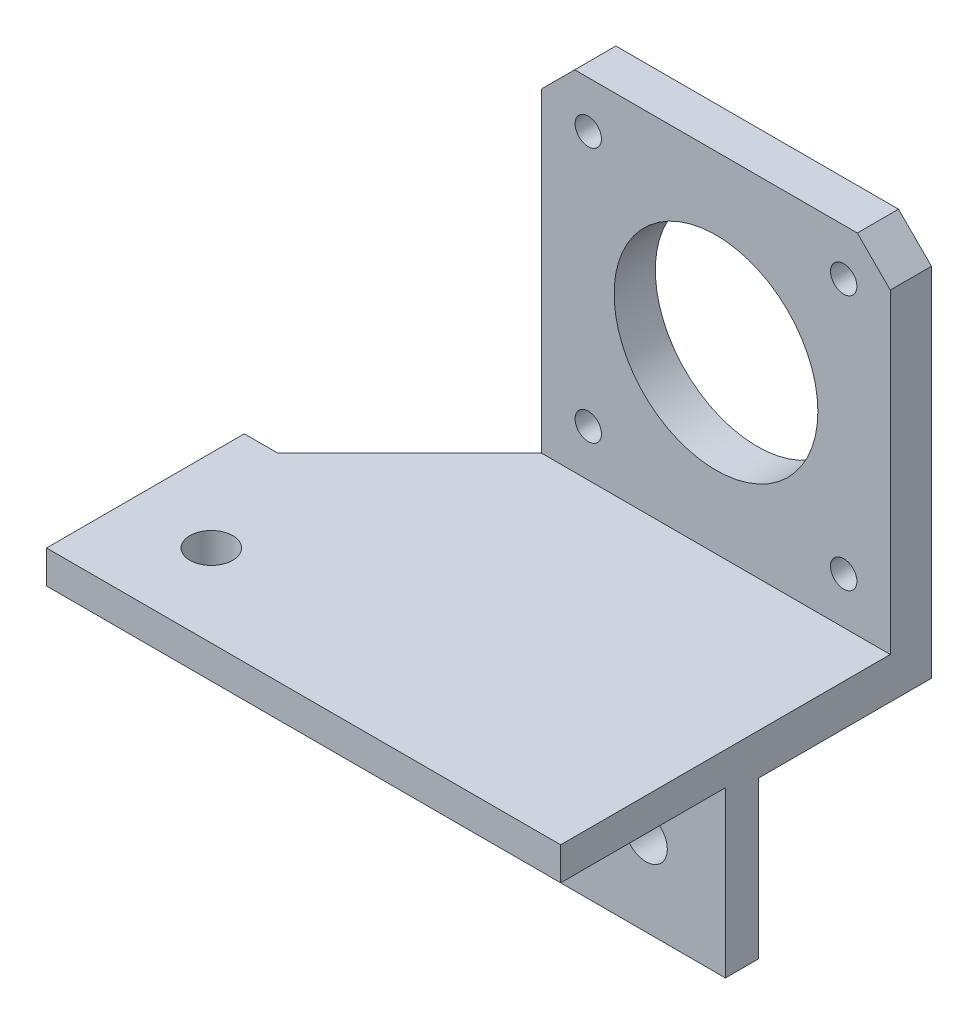
ISO-10303-21;
HEADER;
FILE_DESCRIPTION(('STEP AP214'),'2;1');
FILE_NAME('part.step','',(''),(''),'','','');
FILE_SCHEMA(('AUTOMOTIVE_DESIGN { 1 0 10303 214 1 1 1 1 }'));
ENDSEC;
DATA;
#1=APPLICATION_CONTEXT('core data for automotive mechanical design processes');
#2=APPLICATION_PROTOCOL_DEFINITION('international standard','automotive_design',2000,#1);
#3=PRODUCT_CONTEXT('',#1,'mechanical');
#4=PRODUCT('Part','Part','',(#3));
#5=PRODUCT_RELATED_PRODUCT_CATEGORY('part','',(#4));
#6=PRODUCT_DEFINITION_FORMATION('','',#4);
#7=PRODUCT_DEFINITION_CONTEXT('part definition',#1,'design');
#8=PRODUCT_DEFINITION('design','',#6,#7);
#9=PRODUCT_DEFINITION_SHAPE('','',#8);
#10=(LENGTH_UNIT() NAMED_UNIT(*) SI_UNIT(.MILLI.,.METRE.));
#11=(NAMED_UNIT(*) PLANE_ANGLE_UNIT() SI_UNIT($,.RADIAN.));
#12=(NAMED_UNIT(*) SI_UNIT($,.STERADIAN.) SOLID_ANGLE_UNIT());
#13=UNCERTAINTY_MEASURE_WITH_UNIT(LENGTH_MEASURE(1.E-05),#10,'distance_accuracy_value','');
#14=(GEOMETRIC_REPRESENTATION_CONTEXT(3) GLOBAL_UNCERTAINTY_ASSIGNED_CONTEXT((#13)) GLOBAL_UNIT_ASSIGNED_CONTEXT((#10,
#11,#12)) REPRESENTATION_CONTEXT('',''));
#15=CARTESIAN_POINT('',(0.,0.,0.));
#16=DIRECTION('',(0.,0.,1.));
#17=DIRECTION('',(1.,0.,0.));
#18=AXIS2_PLACEMENT_3D('',#15,#16,#17);
#19=CARTESIAN_POINT('',(0.,0.,-40.));
#20=DIRECTION('',(0.,0.,-1.));
#21=DIRECTION('',(1.,0.,0.));
#22=AXIS2_PLACEMENT_3D('',#19,#20,#21);
#23=PLANE('',#22);
#24=CARTESIAN_POINT('',(-49.6556066891385,-2.97105977085422,-40.));
#25=DIRECTION('',(0.,0.,1.));
#26=DIRECTION('',(1.,0.,0.));
#27=AXIS2_PLACEMENT_3D('',#24,#25,#26);
#28=CIRCLE('',#27,2.6);
#29=CARTESIAN_POINT('',(-47.0556066891385,-2.97105977085422,-40.));
#30=VERTEX_POINT('',#29);
#31=EDGE_CURVE('E181',#30,#30,#28,.T.);
#32=ORIENTED_EDGE('',*,*,#31,.F.);
#33=EDGE_LOOP('',(#32));
#34=FACE_BOUND('',#33,.T.);
#35=CARTESIAN_POINT('',(-69.6556066891385,-2.97105977085422,-40.));
#36=DIRECTION('',(0.,0.,1.));
#37=DIRECTION('',(1.,0.,0.));
#38=AXIS2_PLACEMENT_3D('',#35,#36,#37);
#39=CIRCLE('',#38,2.6);
#40=CARTESIAN_POINT('',(-67.0556066891385,-2.97105977085422,-40.));
#41=VERTEX_POINT('',#40);
#42=EDGE_CURVE('E175',#41,#41,#39,.T.);
#43=ORIENTED_EDGE('',*,*,#42,.F.);
#44=EDGE_LOOP('',(#43));
#45=FACE_BOUND('',#44,.T.);
#46=CARTESIAN_POINT('',(-89.6556066891385,-2.97105977085422,-40.));
#47=DIRECTION('',(0.,0.,1.));
#48=DIRECTION('',(1.,0.,0.));
#49=AXIS2_PLACEMENT_3D('',#46,#47,#48);
#50=CIRCLE('',#49,2.6);
#51=CARTESIAN_POINT('',(-87.0556066891385,-2.97105977085422,-40.));
#52=VERTEX_POINT('',#51);
#53=EDGE_CURVE('E168',#52,#52,#50,.T.);
#54=ORIENTED_EDGE('',*,*,#53,.F.);
#55=EDGE_LOOP('',(#54));
#56=FACE_BOUND('',#55,.T.);
#57=DIRECTION('',(-1.,0.,0.));
#58=VECTOR('',#57,1.);
#59=CARTESIAN_POINT('',(-40.,7.02894022914576,-40.));
#60=LINE('',#59,#58);
#61=CARTESIAN_POINT('',(-40.,7.02894022914575,-40.));
#62=VERTEX_POINT('',#61);
#63=CARTESIAN_POINT('',(-102.391596743468,7.02894022914576,-40.));
#64=VERTEX_POINT('',#63);
#65=EDGE_CURVE('E136',#62,#64,#60,.T.);
#66=ORIENTED_EDGE('',*,*,#65,.T.);
#67=DIRECTION('',(0.,-1.,0.));
#68=VECTOR('',#67,1.);
#69=CARTESIAN_POINT('',(-102.391596743468,-12.9710597708542,-40.));
#70=LINE('',#69,#68);
#71=CARTESIAN_POINT('',(-102.391596743468,-12.9710597708542,-40.));
#72=VERTEX_POINT('',#71);
#73=EDGE_CURVE('E142',#64,#72,#70,.T.);
#74=ORIENTED_EDGE('',*,*,#73,.T.);
#75=DIRECTION('',(1.,0.,0.));
#76=VECTOR('',#75,1.);
#77=CARTESIAN_POINT('',(-40.,-12.9710597708542,-40.));
#78=LINE('',#77,#76);
#79=CARTESIAN_POINT('',(-40.,-12.9710597708542,-40.));
#80=VERTEX_POINT('',#79);
#81=EDGE_CURVE('E151',#72,#80,#78,.T.);
#82=ORIENTED_EDGE('',*,*,#81,.T.);
#83=DIRECTION('',(0.,1.,0.));
#84=VECTOR('',#83,1.);
#85=CARTESIAN_POINT('',(-40.,-12.9710597708542,-40.));
#86=LINE('',#85,#84);
#87=EDGE_CURVE('E152',#80,#62,#86,.T.);
#88=ORIENTED_EDGE('',*,*,#87,.T.);
#89=EDGE_LOOP('',(#66,#74,#82,#88));
#90=FACE_BOUND('',#89,.T.);
#91=ADVANCED_FACE('F33',(#34,#45,#56,#90),#23,.F.);
#92=CARTESIAN_POINT('',(-40.,-12.9710597708542,-44.));
#93=DIRECTION('',(-1.,0.,0.));
#94=DIRECTION('',(0.,0.,-1.));
#95=AXIS2_PLACEMENT_3D('',#92,#93,#94);
#96=PLANE('',#95);
#97=ORIENTED_EDGE('',*,*,#87,.F.);
#98=DIRECTION('',(0.,0.,1.));
#99=VECTOR('',#98,1.);
#100=CARTESIAN_POINT('',(-40.,-12.9710597708542,-44.));
#101=LINE('',#100,#99);
#102=CARTESIAN_POINT('',(-40.,-12.9710597708542,-44.));
#103=VERTEX_POINT('',#102);
#104=EDGE_CURVE('E277',#103,#80,#101,.T.);
#105=ORIENTED_EDGE('',*,*,#104,.F.);
#106=DIRECTION('',(0.,1.,0.));
#107=VECTOR('',#106,1.);
#108=CARTESIAN_POINT('',(-40.,-12.9710597708542,-44.));
#109=LINE('',#108,#107);
#110=CARTESIAN_POINT('',(-40.,6.02894022914576,-44.));
#111=VERTEX_POINT('',#110);
#112=EDGE_CURVE('E267',#103,#111,#109,.T.);
#113=ORIENTED_EDGE('',*,*,#112,.T.);
#114=DIRECTION('',(0.,0.,1.));
#115=VECTOR('',#114,1.);
#116=CARTESIAN_POINT('',(-40.,6.02894022914575,-102.594483210857));
#117=LINE('',#116,#115);
#118=CARTESIAN_POINT('',(-40.,6.02894022914576,-65.));
#119=VERTEX_POINT('',#118);
#120=EDGE_CURVE('E256',#119,#111,#117,.T.);
#121=ORIENTED_EDGE('',*,*,#120,.F.);
#122=DIRECTION('',(0.,1.,0.));
#123=VECTOR('',#122,1.);
#124=CARTESIAN_POINT('',(-40.,6.02894022914576,-65.));
#125=LINE('',#124,#123);
#126=CARTESIAN_POINT('',(-40.0000000000001,49.3289402291458,-65.));
#127=VERTEX_POINT('',#126);
#128=EDGE_CURVE('E217',#119,#127,#125,.T.);
#129=ORIENTED_EDGE('',*,*,#128,.T.);
#130=DIRECTION('',(0.,0.,1.));
#131=VECTOR('',#130,1.);
#132=CARTESIAN_POINT('',(-40.0000000000001,49.3289402291458,-65.));
#133=LINE('',#132,#131);
#134=CARTESIAN_POINT('',(-40.0000000000001,49.3289402291458,-60.));
#135=VERTEX_POINT('',#134);
#136=EDGE_CURVE('E253',#127,#135,#133,.T.);
#137=ORIENTED_EDGE('',*,*,#136,.T.);
#138=DIRECTION('',(0.,1.,0.));
#139=VECTOR('',#138,1.);
#140=CARTESIAN_POINT('',(-40.,6.02894022914576,-60.));
#141=LINE('',#140,#139);
#142=CARTESIAN_POINT('',(-40.,11.0289402291458,-60.));
#143=VERTEX_POINT('',#142);
#144=EDGE_CURVE('E214',#143,#135,#141,.T.);
#145=ORIENTED_EDGE('',*,*,#144,.F.);
#146=DIRECTION('',(0.,0.,1.));
#147=VECTOR('',#146,1.);
#148=CARTESIAN_POINT('',(-40.,11.0289402291458,-44.));
#149=LINE('',#148,#147);
#150=CARTESIAN_POINT('',(-40.,11.0289402291458,-20.));
#151=VERTEX_POINT('',#150);
#152=EDGE_CURVE('E285',#143,#151,#149,.T.);
#153=ORIENTED_EDGE('',*,*,#152,.T.);
#154=DIRECTION('',(0.,1.,0.));
#155=VECTOR('',#154,1.);
#156=CARTESIAN_POINT('',(-40.,11.0289402291458,-20.));
#157=LINE('',#156,#155);
#158=CARTESIAN_POINT('',(-40.,7.02894022914576,-20.));
#159=VERTEX_POINT('',#158);
#160=EDGE_CURVE('E160',#159,#151,#157,.T.);
#161=ORIENTED_EDGE('',*,*,#160,.F.);
#162=DIRECTION('',(0.,0.,-1.));
#163=VECTOR('',#162,1.);
#164=CARTESIAN_POINT('',(-40.,7.02894022914579,42.5196876527665));
#165=LINE('',#164,#163);
#166=EDGE_CURVE('E48',#159,#62,#165,.T.);
#167=ORIENTED_EDGE('',*,*,#166,.T.);
#168=EDGE_LOOP('',(#97,#105,#113,#121,#129,#137,#145,#153,#161,#167));
#169=FACE_BOUND('',#168,.T.);
#170=ADVANCED_FACE('F315',(#169),#96,.F.);
#171=CARTESIAN_POINT('',(-40.,11.0289402291458,-44.));
#172=DIRECTION('',(0.,-1.,0.));
#173=DIRECTION('',(0.,0.,1.));
#174=AXIS2_PLACEMENT_3D('',#171,#172,#173);
#175=PLANE('',#174);
#176=CARTESIAN_POINT('',(-92.3915967434677,11.0289402291458,-30.));
#177=DIRECTION('',(0.,-1.,0.));
#178=DIRECTION('',(0.,0.,-1.));
#179=AXIS2_PLACEMENT_3D('',#176,#177,#178);
#180=CIRCLE('',#179,2.6);
#181=CARTESIAN_POINT('',(-92.3915967434677,11.0289402291458,-32.6));
#182=VERTEX_POINT('',#181);
#183=EDGE_CURVE('E157',#182,#182,#180,.T.);
#184=ORIENTED_EDGE('',*,*,#183,.T.);
#185=EDGE_LOOP('',(#184));
#186=FACE_BOUND('',#185,.T.);
#187=ORIENTED_EDGE('',*,*,#152,.F.);
#188=DIRECTION('',(-1.,0.,0.));
#189=VECTOR('',#188,1.);
#190=CARTESIAN_POINT('',(-40.,11.0289402291458,-60.));
#191=LINE('',#190,#189);
#192=CARTESIAN_POINT('',(-82.3,11.0289402291458,-60.));
#193=VERTEX_POINT('',#192);
#194=EDGE_CURVE('E259',#143,#193,#191,.T.);
#195=ORIENTED_EDGE('',*,*,#194,.T.);
#196=DIRECTION('',(0.707106781186544,0.,-0.707106781186551));
#197=VECTOR('',#196,1.);
#198=CARTESIAN_POINT('',(-69.1500000000003,11.0289402291458,-73.15));
#199=LINE('',#198,#197);
#200=CARTESIAN_POINT('',(-98.3,11.0289402291458,-44.));
#201=VERTEX_POINT('',#200);
#202=EDGE_CURVE('E11',#201,#193,#199,.T.);
#203=ORIENTED_EDGE('',*,*,#202,.F.);
#204=DIRECTION('',(-1.,0.,0.));
#205=VECTOR('',#204,1.);
#206=CARTESIAN_POINT('',(-40.,11.0289402291458,-44.));
#207=LINE('',#206,#205);
#208=CARTESIAN_POINT('',(-102.391596743468,11.0289402291458,-44.));
#209=VERTEX_POINT('',#208);
#210=EDGE_CURVE('E270',#201,#209,#207,.T.);
#211=ORIENTED_EDGE('',*,*,#210,.T.);
#212=DIRECTION('',(0.,0.,1.));
#213=VECTOR('',#212,1.);
#214=CARTESIAN_POINT('',(-102.391596743468,11.0289402291458,-44.));
#215=LINE('',#214,#213);
#216=CARTESIAN_POINT('',(-102.391596743468,11.0289402291458,-20.));
#217=VERTEX_POINT('',#216);
#218=EDGE_CURVE('E282',#209,#217,#215,.T.);
#219=ORIENTED_EDGE('',*,*,#218,.T.);
#220=DIRECTION('',(-1.,0.,0.));
#221=VECTOR('',#220,1.);
#222=CARTESIAN_POINT('',(-40.,11.0289402291458,-20.));
#223=LINE('',#222,#221);
#224=EDGE_CURVE('E164',#151,#217,#223,.T.);
#225=ORIENTED_EDGE('',*,*,#224,.F.);
#226=EDGE_LOOP('',(#187,#195,#203,#211,#219,#225));
#227=FACE_BOUND('',#226,.T.);
#228=ADVANCED_FACE('F298',(#186,#227),#175,.F.);
#229=CARTESIAN_POINT('',(-102.391596743468,-12.9710597708542,-44.));
#230=DIRECTION('',(1.,0.,0.));
#231=DIRECTION('',(0.,0.,1.));
#232=AXIS2_PLACEMENT_3D('',#229,#230,#231);
#233=PLANE('',#232);
#234=ORIENTED_EDGE('',*,*,#218,.F.);
#235=DIRECTION('',(0.,-1.,0.));
#236=VECTOR('',#235,1.);
#237=CARTESIAN_POINT('',(-102.391596743468,-12.9710597708542,-44.));
#238=LINE('',#237,#236);
#239=CARTESIAN_POINT('',(-102.391596743468,-12.9710597708542,-44.));
#240=VERTEX_POINT('',#239);
#241=EDGE_CURVE('E273',#209,#240,#238,.T.);
#242=ORIENTED_EDGE('',*,*,#241,.T.);
#243=DIRECTION('',(0.,0.,1.));
#244=VECTOR('',#243,1.);
#245=CARTESIAN_POINT('',(-102.391596743468,-12.9710597708542,-44.));
#246=LINE('',#245,#244);
#247=EDGE_CURVE('E147',#240,#72,#246,.T.);
#248=ORIENTED_EDGE('',*,*,#247,.T.);
#249=ORIENTED_EDGE('',*,*,#73,.F.);
#250=DIRECTION('',(0.,0.,-1.));
#251=VECTOR('',#250,1.);
#252=CARTESIAN_POINT('',(-102.391596743468,7.02894022914579,42.5196876527665));
#253=LINE('',#252,#251);
#254=CARTESIAN_POINT('',(-102.391596743468,7.02894022914576,-20.));
#255=VERTEX_POINT('',#254);
#256=EDGE_CURVE('E132',#255,#64,#253,.T.);
#257=ORIENTED_EDGE('',*,*,#256,.F.);
#258=DIRECTION('',(0.,-1.,0.));
#259=VECTOR('',#258,1.);
#260=CARTESIAN_POINT('',(-102.391596743468,11.0289402291458,-20.));
#261=LINE('',#260,#259);
#262=EDGE_CURVE('E167',#217,#255,#261,.T.);
#263=ORIENTED_EDGE('',*,*,#262,.F.);
#264=EDGE_LOOP('',(#234,#242,#248,#249,#257,#263));
#265=FACE_BOUND('',#264,.T.);
#266=ADVANCED_FACE('F144',(#265),#233,.F.);
#267=CARTESIAN_POINT('',(-40.,-12.9710597708542,-44.));
#268=DIRECTION('',(0.,1.,0.));
#269=DIRECTION('',(0.,0.,-1.));
#270=AXIS2_PLACEMENT_3D('',#267,#268,#269);
#271=PLANE('',#270);
#272=ORIENTED_EDGE('',*,*,#81,.F.);
#273=ORIENTED_EDGE('',*,*,#247,.F.);
#274=DIRECTION('',(1.,0.,0.));
#275=VECTOR('',#274,1.);
#276=CARTESIAN_POINT('',(-40.,-12.9710597708542,-44.));
#277=LINE('',#276,#275);
#278=EDGE_CURVE('E275',#240,#103,#277,.T.);
#279=ORIENTED_EDGE('',*,*,#278,.T.);
#280=ORIENTED_EDGE('',*,*,#104,.T.);
#281=EDGE_LOOP('',(#272,#273,#279,#280));
#282=FACE_BOUND('',#281,.T.);
#283=ADVANCED_FACE('F317',(#282),#271,.F.);
#284=CARTESIAN_POINT('',(0.,0.,-44.));
#285=DIRECTION('',(0.,0.,-1.));
#286=DIRECTION('',(1.,0.,0.));
#287=AXIS2_PLACEMENT_3D('',#284,#285,#286);
#288=PLANE('',#287);
#289=CARTESIAN_POINT('',(-89.6556066891385,-2.97105977085422,-44.));
#290=DIRECTION('',(0.,0.,1.));
#291=DIRECTION('',(1.,0.,0.));
#292=AXIS2_PLACEMENT_3D('',#289,#290,#291);
#293=CIRCLE('',#292,2.6);
#294=CARTESIAN_POINT('',(-87.0556066891385,-2.97105977085422,-44.));
#295=VERTEX_POINT('',#294);
#296=EDGE_CURVE('E172',#295,#295,#293,.T.);
#297=ORIENTED_EDGE('',*,*,#296,.T.);
#298=EDGE_LOOP('',(#297));
#299=FACE_BOUND('',#298,.T.);
#300=CARTESIAN_POINT('',(-69.6556066891385,-2.97105977085422,-44.));
#301=DIRECTION('',(0.,0.,1.));
#302=DIRECTION('',(1.,0.,0.));
#303=AXIS2_PLACEMENT_3D('',#300,#301,#302);
#304=CIRCLE('',#303,2.6);
#305=CARTESIAN_POINT('',(-67.0556066891385,-2.97105977085422,-44.));
#306=VERTEX_POINT('',#305);
#307=EDGE_CURVE('E178',#306,#306,#304,.T.);
#308=ORIENTED_EDGE('',*,*,#307,.T.);
#309=EDGE_LOOP('',(#308));
#310=FACE_BOUND('',#309,.T.);
#311=CARTESIAN_POINT('',(-49.6556066891385,-2.97105977085422,-44.));
#312=DIRECTION('',(0.,0.,1.));
#313=DIRECTION('',(1.,0.,0.));
#314=AXIS2_PLACEMENT_3D('',#311,#312,#313);
#315=CIRCLE('',#314,2.6);
#316=CARTESIAN_POINT('',(-47.0556066891385,-2.97105977085422,-44.));
#317=VERTEX_POINT('',#316);
#318=EDGE_CURVE('E184',#317,#317,#315,.T.);
#319=ORIENTED_EDGE('',*,*,#318,.T.);
#320=EDGE_LOOP('',(#319));
#321=FACE_BOUND('',#320,.T.);
#322=DIRECTION('',(1.,0.,0.));
#323=VECTOR('',#322,1.);
#324=CARTESIAN_POINT('',(-40.,6.02894022914577,-44.));
#325=LINE('',#324,#323);
#326=CARTESIAN_POINT('',(-98.3,6.02894022914576,-44.));
#327=VERTEX_POINT('',#326);
#328=EDGE_CURVE('E257',#327,#111,#325,.T.);
#329=ORIENTED_EDGE('',*,*,#328,.T.);
#330=ORIENTED_EDGE('',*,*,#112,.F.);
#331=ORIENTED_EDGE('',*,*,#278,.F.);
#332=ORIENTED_EDGE('',*,*,#241,.F.);
#333=ORIENTED_EDGE('',*,*,#210,.F.);
#334=DIRECTION('',(0.,1.,0.));
#335=VECTOR('',#334,1.);
#336=CARTESIAN_POINT('',(-98.3,0.,-44.));
#337=LINE('',#336,#335);
#338=EDGE_CURVE('E290',#327,#201,#337,.T.);
#339=ORIENTED_EDGE('',*,*,#338,.F.);
#340=EDGE_LOOP('',(#329,#330,#331,#332,#333,#339));
#341=FACE_BOUND('',#340,.T.);
#342=ADVANCED_FACE('F295',(#299,#310,#321,#341),#288,.T.);
#343=CARTESIAN_POINT('',(-82.3,11.0289402291457,-102.594483210857));
#344=DIRECTION('',(1.,0.,0.));
#345=DIRECTION('',(0.,0.,1.));
#346=AXIS2_PLACEMENT_3D('',#343,#344,#345);
#347=PLANE('',#346);
#348=DIRECTION('',(0.,-1.,0.));
#349=VECTOR('',#348,1.);
#350=CARTESIAN_POINT('',(-82.3,6.02894022914576,-60.));
#351=LINE('',#350,#349);
#352=CARTESIAN_POINT('',(-82.3,49.3289402291458,-60.));
#353=VERTEX_POINT('',#352);
#354=EDGE_CURVE('E221',#353,#193,#351,.T.);
#355=ORIENTED_EDGE('',*,*,#354,.F.);
#356=DIRECTION('',(0.,0.,1.));
#357=VECTOR('',#356,1.);
#358=CARTESIAN_POINT('',(-82.3,49.3289402291458,-65.));
#359=LINE('',#358,#357);
#360=CARTESIAN_POINT('',(-82.3,49.3289402291458,-65.));
#361=VERTEX_POINT('',#360);
#362=EDGE_CURVE('E234',#361,#353,#359,.T.);
#363=ORIENTED_EDGE('',*,*,#362,.F.);
#364=DIRECTION('',(0.,-1.,0.));
#365=VECTOR('',#364,1.);
#366=CARTESIAN_POINT('',(-82.3,6.02894022914575,-65.));
#367=LINE('',#366,#365);
#368=CARTESIAN_POINT('',(-82.3,6.02894022914575,-65.));
#369=VERTEX_POINT('',#368);
#370=EDGE_CURVE('E229',#361,#369,#367,.T.);
#371=ORIENTED_EDGE('',*,*,#370,.T.);
#372=DIRECTION('',(0.,0.,1.));
#373=VECTOR('',#372,1.);
#374=CARTESIAN_POINT('',(-82.3,6.02894022914574,-102.594483210857));
#375=LINE('',#374,#373);
#376=CARTESIAN_POINT('',(-82.3,6.02894022914576,-60.0000000000001));
#377=VERTEX_POINT('',#376);
#378=EDGE_CURVE('E260',#369,#377,#375,.T.);
#379=ORIENTED_EDGE('',*,*,#378,.T.);
#380=DIRECTION('',(0.,-1.,0.));
#381=VECTOR('',#380,1.);
#382=CARTESIAN_POINT('',(-82.3,11.0289402291458,-60.0000000000001));
#383=LINE('',#382,#381);
#384=EDGE_CURVE('E288',#193,#377,#383,.T.);
#385=ORIENTED_EDGE('',*,*,#384,.F.);
#386=EDGE_LOOP('',(#355,#363,#371,#379,#385));
#387=FACE_BOUND('',#386,.T.);
#388=ADVANCED_FACE('F306',(#387),#347,.F.);
#389=CARTESIAN_POINT('',(-40.,6.02894022914575,-102.594483210857));
#390=DIRECTION('',(0.,1.,0.));
#391=DIRECTION('',(-1.,0.,0.));
#392=AXIS2_PLACEMENT_3D('',#389,#390,#391);
#393=PLANE('',#392);
#394=ORIENTED_EDGE('',*,*,#120,.T.);
#395=ORIENTED_EDGE('',*,*,#328,.F.);
#396=DIRECTION('',(-0.707106781186544,0.,0.707106781186551));
#397=VECTOR('',#396,1.);
#398=CARTESIAN_POINT('',(-39.8527583945717,6.02894022914575,-102.447241605429));
#399=LINE('',#398,#397);
#400=EDGE_CURVE('E41',#377,#327,#399,.T.);
#401=ORIENTED_EDGE('',*,*,#400,.F.);
#402=ORIENTED_EDGE('',*,*,#378,.F.);
#403=DIRECTION('',(1.,0.,0.));
#404=VECTOR('',#403,1.);
#405=CARTESIAN_POINT('',(-40.,6.02894022914576,-65.));
#406=LINE('',#405,#404);
#407=EDGE_CURVE('E232',#369,#119,#406,.T.);
#408=ORIENTED_EDGE('',*,*,#407,.T.);
#409=EDGE_LOOP('',(#394,#395,#401,#402,#408));
#410=FACE_BOUND('',#409,.T.);
#411=ADVANCED_FACE('F310',(#410),#393,.F.);
#412=CARTESIAN_POINT('',(0.,0.,-60.));
#413=DIRECTION('',(0.,0.,-1.));
#414=DIRECTION('',(1.,0.,0.));
#415=AXIS2_PLACEMENT_3D('',#412,#413,#414);
#416=PLANE('',#415);
#417=CARTESIAN_POINT('',(-45.65,47.6789402291458,-60.));
#418=DIRECTION('',(0.,0.,1.));
#419=DIRECTION('',(1.,0.,0.));
#420=AXIS2_PLACEMENT_3D('',#417,#418,#419);
#421=CIRCLE('',#420,1.6);
#422=CARTESIAN_POINT('',(-44.05,47.6789402291458,-60.));
#423=VERTEX_POINT('',#422);
#424=EDGE_CURVE('E208',#423,#423,#421,.T.);
#425=ORIENTED_EDGE('',*,*,#424,.F.);
#426=EDGE_LOOP('',(#425));
#427=FACE_BOUND('',#426,.T.);
#428=CARTESIAN_POINT('',(-61.15,32.1789402291458,-60.));
#429=DIRECTION('',(0.,0.,1.));
#430=DIRECTION('',(1.,0.,0.));
#431=AXIS2_PLACEMENT_3D('',#428,#429,#430);
#432=CIRCLE('',#431,12.3643409800213);
#433=CARTESIAN_POINT('',(-48.7856590199787,32.1789402291458,-60.));
#434=VERTEX_POINT('',#433);
#435=EDGE_CURVE('E202',#434,#434,#432,.T.);
#436=ORIENTED_EDGE('',*,*,#435,.F.);
#437=EDGE_LOOP('',(#436));
#438=FACE_BOUND('',#437,.T.);
#439=CARTESIAN_POINT('',(-76.65,47.6789402291455,-60.));
#440=DIRECTION('',(0.,0.,1.));
#441=DIRECTION('',(1.,0.,0.));
#442=AXIS2_PLACEMENT_3D('',#439,#440,#441);
#443=CIRCLE('',#442,1.6);
#444=CARTESIAN_POINT('',(-75.05,47.6789402291455,-60.));
#445=VERTEX_POINT('',#444);
#446=EDGE_CURVE('E196',#445,#445,#443,.T.);
#447=ORIENTED_EDGE('',*,*,#446,.F.);
#448=EDGE_LOOP('',(#447));
#449=FACE_BOUND('',#448,.T.);
#450=CARTESIAN_POINT('',(-76.6499999999997,16.6789402291455,-60.));
#451=DIRECTION('',(0.,0.,1.));
#452=DIRECTION('',(1.,0.,0.));
#453=AXIS2_PLACEMENT_3D('',#450,#451,#452);
#454=CIRCLE('',#453,1.6);
#455=CARTESIAN_POINT('',(-75.0499999999997,16.6789402291455,-60.));
#456=VERTEX_POINT('',#455);
#457=EDGE_CURVE('E190',#456,#456,#454,.T.);
#458=ORIENTED_EDGE('',*,*,#457,.F.);
#459=EDGE_LOOP('',(#458));
#460=FACE_BOUND('',#459,.T.);
#461=CARTESIAN_POINT('',(-45.6499999999997,16.6789402291458,-60.));
#462=DIRECTION('',(0.,0.,1.));
#463=DIRECTION('',(1.,0.,0.));
#464=AXIS2_PLACEMENT_3D('',#461,#462,#463);
#465=CIRCLE('',#464,1.6);
#466=CARTESIAN_POINT('',(-44.0499999999997,16.6789402291458,-60.));
#467=VERTEX_POINT('',#466);
#468=EDGE_CURVE('E171',#467,#467,#465,.T.);
#469=ORIENTED_EDGE('',*,*,#468,.F.);
#470=EDGE_LOOP('',(#469));
#471=FACE_BOUND('',#470,.T.);
#472=ORIENTED_EDGE('',*,*,#144,.T.);
#473=DIRECTION('',(-0.707106781186548,0.707106781186547,0.));
#474=VECTOR('',#473,1.);
#475=CARTESIAN_POINT('',(-40.0000000000001,49.3289402291458,-60.));
#476=LINE('',#475,#474);
#477=CARTESIAN_POINT('',(-44.,53.3289402291458,-60.));
#478=VERTEX_POINT('',#477);
#479=EDGE_CURVE('E237',#135,#478,#476,.T.);
#480=ORIENTED_EDGE('',*,*,#479,.T.);
#481=DIRECTION('',(-1.,0.,0.));
#482=VECTOR('',#481,1.);
#483=CARTESIAN_POINT('',(-44.,53.3289402291458,-60.));
#484=LINE('',#483,#482);
#485=CARTESIAN_POINT('',(-78.3000000000001,53.3289402291457,-60.));
#486=VERTEX_POINT('',#485);
#487=EDGE_CURVE('E240',#478,#486,#484,.T.);
#488=ORIENTED_EDGE('',*,*,#487,.T.);
#489=DIRECTION('',(-0.707106781186547,-0.707106781186547,0.));
#490=VECTOR('',#489,1.);
#491=CARTESIAN_POINT('',(-78.3000000000001,53.3289402291457,-60.));
#492=LINE('',#491,#490);
#493=EDGE_CURVE('E243',#486,#353,#492,.T.);
#494=ORIENTED_EDGE('',*,*,#493,.T.);
#495=ORIENTED_EDGE('',*,*,#354,.T.);
#496=ORIENTED_EDGE('',*,*,#194,.F.);
#497=EDGE_LOOP('',(#472,#480,#488,#494,#495,#496));
#498=FACE_BOUND('',#497,.T.);
#499=ADVANCED_FACE('F301',(#427,#438,#449,#460,#471,#498),#416,.F.);
#500=CARTESIAN_POINT('',(0.,0.,-65.));
#501=DIRECTION('',(0.,0.,-1.));
#502=DIRECTION('',(1.,0.,0.));
#503=AXIS2_PLACEMENT_3D('',#500,#501,#502);
#504=PLANE('',#503);
#505=CARTESIAN_POINT('',(-76.6499999999997,16.6789402291455,-65.));
#506=DIRECTION('',(0.,0.,1.));
#507=DIRECTION('',(1.,0.,0.));
#508=AXIS2_PLACEMENT_3D('',#505,#506,#507);
#509=CIRCLE('',#508,1.6);
#510=CARTESIAN_POINT('',(-75.0499999999997,16.6789402291455,-65.));
#511=VERTEX_POINT('',#510);
#512=EDGE_CURVE('E193',#511,#511,#509,.T.);
#513=ORIENTED_EDGE('',*,*,#512,.T.);
#514=EDGE_LOOP('',(#513));
#515=FACE_BOUND('',#514,.T.);
#516=CARTESIAN_POINT('',(-61.15,32.1789402291458,-65.));
#517=DIRECTION('',(0.,0.,1.));
#518=DIRECTION('',(1.,0.,0.));
#519=AXIS2_PLACEMENT_3D('',#516,#517,#518);
#520=CIRCLE('',#519,12.3643409800213);
#521=CARTESIAN_POINT('',(-48.7856590199787,32.1789402291458,-65.));
#522=VERTEX_POINT('',#521);
#523=EDGE_CURVE('E205',#522,#522,#520,.T.);
#524=ORIENTED_EDGE('',*,*,#523,.T.);
#525=EDGE_LOOP('',(#524));
#526=FACE_BOUND('',#525,.T.);
#527=ORIENTED_EDGE('',*,*,#128,.F.);
#528=ORIENTED_EDGE('',*,*,#407,.F.);
#529=ORIENTED_EDGE('',*,*,#370,.F.);
#530=DIRECTION('',(-0.707106781186547,-0.707106781186547,0.));
#531=VECTOR('',#530,1.);
#532=CARTESIAN_POINT('',(-78.3000000000001,53.3289402291457,-65.));
#533=LINE('',#532,#531);
#534=CARTESIAN_POINT('',(-78.3000000000001,53.3289402291457,-65.));
#535=VERTEX_POINT('',#534);
#536=EDGE_CURVE('E227',#535,#361,#533,.T.);
#537=ORIENTED_EDGE('',*,*,#536,.F.);
#538=DIRECTION('',(-1.,0.,0.));
#539=VECTOR('',#538,1.);
#540=CARTESIAN_POINT('',(-44.,53.3289402291458,-65.));
#541=LINE('',#540,#539);
#542=CARTESIAN_POINT('',(-44.,53.3289402291458,-65.));
#543=VERTEX_POINT('',#542);
#544=EDGE_CURVE('E224',#543,#535,#541,.T.);
#545=ORIENTED_EDGE('',*,*,#544,.F.);
#546=DIRECTION('',(-0.707106781186548,0.707106781186547,0.));
#547=VECTOR('',#546,1.);
#548=CARTESIAN_POINT('',(-40.0000000000001,49.3289402291458,-65.));
#549=LINE('',#548,#547);
#550=EDGE_CURVE('E220',#127,#543,#549,.T.);
#551=ORIENTED_EDGE('',*,*,#550,.F.);
#552=EDGE_LOOP('',(#527,#528,#529,#537,#545,#551));
#553=FACE_BOUND('',#552,.T.);
#554=CARTESIAN_POINT('',(-45.65,47.6789402291458,-65.));
#555=DIRECTION('',(0.,0.,1.));
#556=DIRECTION('',(1.,0.,0.));
#557=AXIS2_PLACEMENT_3D('',#554,#555,#556);
#558=CIRCLE('',#557,1.6);
#559=CARTESIAN_POINT('',(-44.05,47.6789402291458,-65.));
#560=VERTEX_POINT('',#559);
#561=EDGE_CURVE('E211',#560,#560,#558,.T.);
#562=ORIENTED_EDGE('',*,*,#561,.T.);
#563=EDGE_LOOP('',(#562));
#564=FACE_BOUND('',#563,.T.);
#565=CARTESIAN_POINT('',(-76.65,47.6789402291455,-65.));
#566=DIRECTION('',(0.,0.,1.));
#567=DIRECTION('',(1.,0.,0.));
#568=AXIS2_PLACEMENT_3D('',#565,#566,#567);
#569=CIRCLE('',#568,1.6);
#570=CARTESIAN_POINT('',(-75.05,47.6789402291455,-65.));
#571=VERTEX_POINT('',#570);
#572=EDGE_CURVE('E199',#571,#571,#569,.T.);
#573=ORIENTED_EDGE('',*,*,#572,.T.);
#574=EDGE_LOOP('',(#573));
#575=FACE_BOUND('',#574,.T.);
#576=CARTESIAN_POINT('',(-45.6499999999997,16.6789402291458,-65.));
#577=DIRECTION('',(0.,0.,1.));
#578=DIRECTION('',(1.,0.,0.));
#579=AXIS2_PLACEMENT_3D('',#576,#577,#578);
#580=CIRCLE('',#579,1.6);
#581=CARTESIAN_POINT('',(-44.0499999999997,16.6789402291458,-65.));
#582=VERTEX_POINT('',#581);
#583=EDGE_CURVE('E187',#582,#582,#580,.T.);
#584=ORIENTED_EDGE('',*,*,#583,.T.);
#585=EDGE_LOOP('',(#584));
#586=FACE_BOUND('',#585,.T.);
#587=ADVANCED_FACE('F332',(#515,#526,#553,#564,#575,#586),#504,.T.);
#588=CARTESIAN_POINT('',(-40.0000000000001,49.3289402291458,-65.));
#589=DIRECTION('',(-0.707106781186547,-0.707106781186548,0.));
#590=DIRECTION('',(0.707106781186548,-0.707106781186547,0.));
#591=AXIS2_PLACEMENT_3D('',#588,#589,#590);
#592=PLANE('',#591);
#593=ORIENTED_EDGE('',*,*,#479,.F.);
#594=ORIENTED_EDGE('',*,*,#136,.F.);
#595=ORIENTED_EDGE('',*,*,#550,.T.);
#596=DIRECTION('',(0.,0.,1.));
#597=VECTOR('',#596,1.);
#598=CARTESIAN_POINT('',(-44.,53.3289402291458,-65.));
#599=LINE('',#598,#597);
#600=EDGE_CURVE('E251',#543,#478,#599,.T.);
#601=ORIENTED_EDGE('',*,*,#600,.T.);
#602=EDGE_LOOP('',(#593,#594,#595,#601));
#603=FACE_BOUND('',#602,.T.);
#604=ADVANCED_FACE('F323',(#603),#592,.F.);
#605=CARTESIAN_POINT('',(-44.,53.3289402291458,-65.));
#606=DIRECTION('',(0.,-1.,0.));
#607=DIRECTION('',(1.,0.,0.));
#608=AXIS2_PLACEMENT_3D('',#605,#606,#607);
#609=PLANE('',#608);
#610=ORIENTED_EDGE('',*,*,#487,.F.);
#611=ORIENTED_EDGE('',*,*,#600,.F.);
#612=ORIENTED_EDGE('',*,*,#544,.T.);
#613=DIRECTION('',(0.,0.,1.));
#614=VECTOR('',#613,1.);
#615=CARTESIAN_POINT('',(-78.3000000000001,53.3289402291457,-65.));
#616=LINE('',#615,#614);
#617=EDGE_CURVE('E249',#535,#486,#616,.T.);
#618=ORIENTED_EDGE('',*,*,#617,.T.);
#619=EDGE_LOOP('',(#610,#611,#612,#618));
#620=FACE_BOUND('',#619,.T.);
#621=ADVANCED_FACE('F327',(#620),#609,.F.);
#622=CARTESIAN_POINT('',(-78.3000000000001,53.3289402291457,-65.));
#623=DIRECTION('',(0.707106781186548,-0.707106781186548,0.));
#624=DIRECTION('',(0.707106781186548,0.707106781186548,0.));
#625=AXIS2_PLACEMENT_3D('',#622,#623,#624);
#626=PLANE('',#625);
#627=ORIENTED_EDGE('',*,*,#493,.F.);
#628=ORIENTED_EDGE('',*,*,#617,.F.);
#629=ORIENTED_EDGE('',*,*,#536,.T.);
#630=ORIENTED_EDGE('',*,*,#362,.T.);
#631=EDGE_LOOP('',(#627,#628,#629,#630));
#632=FACE_BOUND('',#631,.T.);
#633=ADVANCED_FACE('F330',(#632),#626,.F.);
#634=CARTESIAN_POINT('',(-45.65,47.6789402291458,-65.));
#635=DIRECTION('',(0.,0.,1.));
#636=DIRECTION('',(-1.,0.,0.));
#637=AXIS2_PLACEMENT_3D('',#634,#635,#636);
#638=CYLINDRICAL_SURFACE('',#637,1.6);
#639=ORIENTED_EDGE('',*,*,#561,.F.);
#640=EDGE_LOOP('',(#639));
#641=FACE_BOUND('',#640,.T.);
#642=ORIENTED_EDGE('',*,*,#424,.T.);
#643=EDGE_LOOP('',(#642));
#644=FACE_BOUND('',#643,.T.);
#645=ADVANCED_FACE('F418',(#641,#644),#638,.F.);
#646=CARTESIAN_POINT('',(-61.15,32.1789402291458,-65.));
#647=DIRECTION('',(0.,0.,1.));
#648=DIRECTION('',(-1.,0.,0.));
#649=AXIS2_PLACEMENT_3D('',#646,#647,#648);
#650=CYLINDRICAL_SURFACE('',#649,12.3643409800213);
#651=ORIENTED_EDGE('',*,*,#523,.F.);
#652=EDGE_LOOP('',(#651));
#653=FACE_BOUND('',#652,.T.);
#654=ORIENTED_EDGE('',*,*,#435,.T.);
#655=EDGE_LOOP('',(#654));
#656=FACE_BOUND('',#655,.T.);
#657=ADVANCED_FACE('F414',(#653,#656),#650,.F.);
#658=CARTESIAN_POINT('',(-76.65,47.6789402291455,-65.));
#659=DIRECTION('',(0.,0.,1.));
#660=DIRECTION('',(-1.,0.,0.));
#661=AXIS2_PLACEMENT_3D('',#658,#659,#660);
#662=CYLINDRICAL_SURFACE('',#661,1.6);
#663=ORIENTED_EDGE('',*,*,#572,.F.);
#664=EDGE_LOOP('',(#663));
#665=FACE_BOUND('',#664,.T.);
#666=ORIENTED_EDGE('',*,*,#446,.T.);
#667=EDGE_LOOP('',(#666));
#668=FACE_BOUND('',#667,.T.);
#669=ADVANCED_FACE('F410',(#665,#668),#662,.F.);
#670=CARTESIAN_POINT('',(-76.6499999999997,16.6789402291455,-65.));
#671=DIRECTION('',(0.,0.,1.));
#672=DIRECTION('',(-1.,0.,0.));
#673=AXIS2_PLACEMENT_3D('',#670,#671,#672);
#674=CYLINDRICAL_SURFACE('',#673,1.6);
#675=ORIENTED_EDGE('',*,*,#512,.F.);
#676=EDGE_LOOP('',(#675));
#677=FACE_BOUND('',#676,.T.);
#678=ORIENTED_EDGE('',*,*,#457,.T.);
#679=EDGE_LOOP('',(#678));
#680=FACE_BOUND('',#679,.T.);
#681=ADVANCED_FACE('F346',(#677,#680),#674,.F.);
#682=CARTESIAN_POINT('',(-45.6499999999997,16.6789402291458,-65.));
#683=DIRECTION('',(0.,0.,1.));
#684=DIRECTION('',(-1.,0.,0.));
#685=AXIS2_PLACEMENT_3D('',#682,#683,#684);
#686=CYLINDRICAL_SURFACE('',#685,1.6);
#687=ORIENTED_EDGE('',*,*,#583,.F.);
#688=EDGE_LOOP('',(#687));
#689=FACE_BOUND('',#688,.T.);
#690=ORIENTED_EDGE('',*,*,#468,.T.);
#691=EDGE_LOOP('',(#690));
#692=FACE_BOUND('',#691,.T.);
#693=ADVANCED_FACE('F343',(#689,#692),#686,.F.);
#694=CARTESIAN_POINT('',(-82.3,11.0289402291458,-60.0000000000001));
#695=DIRECTION('',(0.707106781186551,0.,0.707106781186544));
#696=DIRECTION('',(0.,-1.,0.));
#697=AXIS2_PLACEMENT_3D('',#694,#695,#696);
#698=PLANE('',#697);
#699=ORIENTED_EDGE('',*,*,#202,.T.);
#700=ORIENTED_EDGE('',*,*,#384,.T.);
#701=ORIENTED_EDGE('',*,*,#400,.T.);
#702=ORIENTED_EDGE('',*,*,#338,.T.);
#703=EDGE_LOOP('',(#699,#700,#701,#702));
#704=FACE_BOUND('',#703,.T.);
#705=ADVANCED_FACE('F35',(#704),#698,.F.);
#706=CARTESIAN_POINT('',(-49.6556066891385,-2.97105977085422,-40.));
#707=DIRECTION('',(0.,0.,-1.));
#708=DIRECTION('',(1.,0.,0.));
#709=AXIS2_PLACEMENT_3D('',#706,#707,#708);
#710=CYLINDRICAL_SURFACE('',#709,2.6);
#711=ORIENTED_EDGE('',*,*,#31,.T.);
#712=EDGE_LOOP('',(#711));
#713=FACE_BOUND('',#712,.T.);
#714=ORIENTED_EDGE('',*,*,#318,.F.);
#715=EDGE_LOOP('',(#714));
#716=FACE_BOUND('',#715,.T.);
#717=ADVANCED_FACE('F403',(#713,#716),#710,.F.);
#718=CARTESIAN_POINT('',(-69.6556066891385,-2.97105977085422,-40.));
#719=DIRECTION('',(0.,0.,-1.));
#720=DIRECTION('',(1.,0.,0.));
#721=AXIS2_PLACEMENT_3D('',#718,#719,#720);
#722=CYLINDRICAL_SURFACE('',#721,2.6);
#723=ORIENTED_EDGE('',*,*,#42,.T.);
#724=EDGE_LOOP('',(#723));
#725=FACE_BOUND('',#724,.T.);
#726=ORIENTED_EDGE('',*,*,#307,.F.);
#727=EDGE_LOOP('',(#726));
#728=FACE_BOUND('',#727,.T.);
#729=ADVANCED_FACE('F399',(#725,#728),#722,.F.);
#730=CARTESIAN_POINT('',(-89.6556066891385,-2.97105977085422,-40.));
#731=DIRECTION('',(0.,0.,-1.));
#732=DIRECTION('',(1.,0.,0.));
#733=AXIS2_PLACEMENT_3D('',#730,#731,#732);
#734=CYLINDRICAL_SURFACE('',#733,2.6);
#735=ORIENTED_EDGE('',*,*,#53,.T.);
#736=EDGE_LOOP('',(#735));
#737=FACE_BOUND('',#736,.T.);
#738=ORIENTED_EDGE('',*,*,#296,.F.);
#739=EDGE_LOOP('',(#738));
#740=FACE_BOUND('',#739,.T.);
#741=ADVANCED_FACE('F395',(#737,#740),#734,.F.);
#742=CARTESIAN_POINT('',(-40.,7.02894022914579,42.5196876527665));
#743=DIRECTION('',(0.,1.,0.));
#744=DIRECTION('',(0.,0.,-1.));
#745=AXIS2_PLACEMENT_3D('',#742,#743,#744);
#746=PLANE('',#745);
#747=CARTESIAN_POINT('',(-92.3915967434677,7.02894022914577,-30.));
#748=DIRECTION('',(0.,-1.,0.));
#749=DIRECTION('',(0.,0.,-1.));
#750=AXIS2_PLACEMENT_3D('',#747,#748,#749);
#751=CIRCLE('',#750,2.6);
#752=CARTESIAN_POINT('',(-92.3915967434677,7.02894022914577,-32.6));
#753=VERTEX_POINT('',#752);
#754=EDGE_CURVE('E154',#753,#753,#751,.T.);
#755=ORIENTED_EDGE('',*,*,#754,.F.);
#756=EDGE_LOOP('',(#755));
#757=FACE_BOUND('',#756,.T.);
#758=ORIENTED_EDGE('',*,*,#256,.T.);
#759=ORIENTED_EDGE('',*,*,#65,.F.);
#760=ORIENTED_EDGE('',*,*,#166,.F.);
#761=DIRECTION('',(1.,0.,0.));
#762=VECTOR('',#761,1.);
#763=CARTESIAN_POINT('',(-40.,7.02894022914576,-20.));
#764=LINE('',#763,#762);
#765=EDGE_CURVE('E137',#255,#159,#764,.T.);
#766=ORIENTED_EDGE('',*,*,#765,.F.);
#767=EDGE_LOOP('',(#758,#759,#760,#766));
#768=FACE_BOUND('',#767,.T.);
#769=ADVANCED_FACE('F134',(#757,#768),#746,.F.);
#770=CARTESIAN_POINT('',(-350.,-6.10905977085424,-20.));
#771=DIRECTION('',(0.,0.,-1.));
#772=DIRECTION('',(1.,0.,0.));
#773=AXIS2_PLACEMENT_3D('',#770,#771,#772);
#774=PLANE('',#773);
#775=ORIENTED_EDGE('',*,*,#765,.T.);
#776=ORIENTED_EDGE('',*,*,#160,.T.);
#777=ORIENTED_EDGE('',*,*,#224,.T.);
#778=ORIENTED_EDGE('',*,*,#262,.T.);
#779=EDGE_LOOP('',(#775,#776,#777,#778));
#780=FACE_BOUND('',#779,.T.);
#781=ADVANCED_FACE('F320',(#780),#774,.F.);
#782=CARTESIAN_POINT('',(-92.3915967434677,7.02894022914577,-30.));
#783=DIRECTION('',(0.,1.,0.));
#784=DIRECTION('',(0.,0.,-1.));
#785=AXIS2_PLACEMENT_3D('',#782,#783,#784);
#786=CYLINDRICAL_SURFACE('',#785,2.6);
#787=ORIENTED_EDGE('',*,*,#754,.T.);
#788=EDGE_LOOP('',(#787));
#789=FACE_BOUND('',#788,.T.);
#790=ORIENTED_EDGE('',*,*,#183,.F.);
#791=EDGE_LOOP('',(#790));
#792=FACE_BOUND('',#791,.T.);
#793=ADVANCED_FACE('F384',(#789,#792),#786,.F.);
#794=CLOSED_SHELL('',(#91,#170,#228,#266,#283,#342,#388,#411,#499,#587,#604,#621,#633,#645,#657,
#669,#681,#693,#705,#717,#729,#741,#769,#781,#793));
#795=MANIFOLD_SOLID_BREP('B2',#794);
#796=ADVANCED_BREP_SHAPE_REPRESENTATION('',(#18,#795),#14);
#797=SHAPE_DEFINITION_REPRESENTATION(#9,#796);
ENDSEC;
END-ISO-10303-21;
